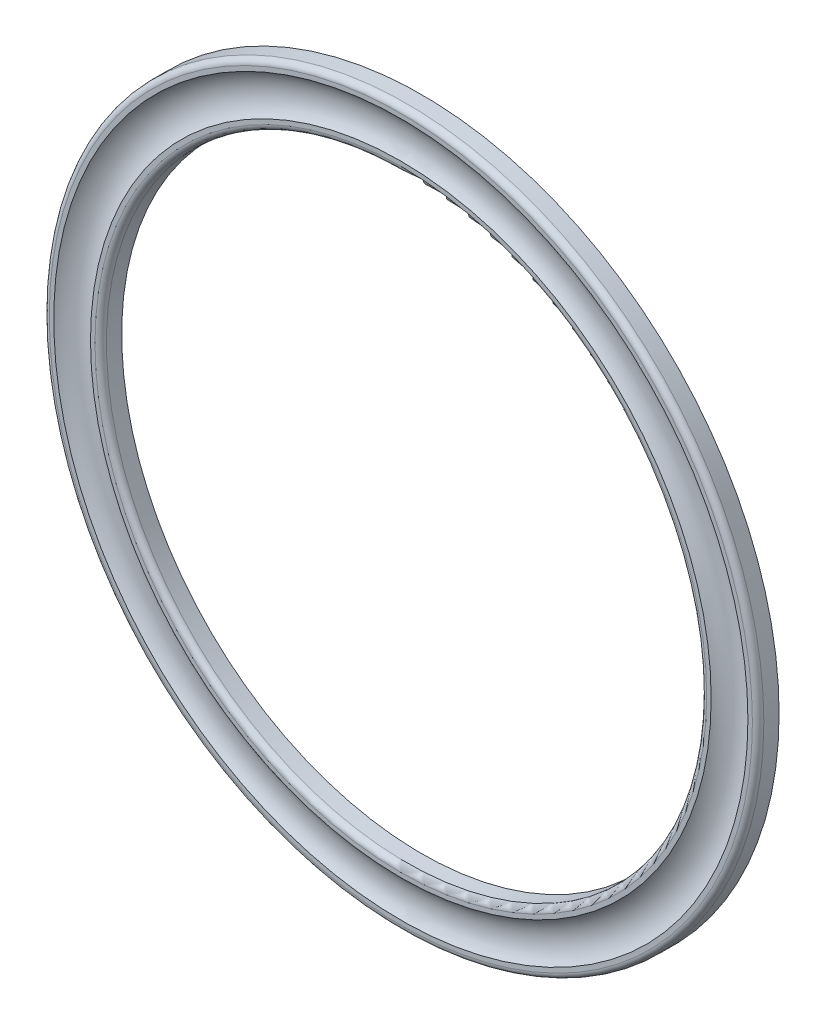
ISO-10303-21;
HEADER;
FILE_DESCRIPTION(('STEP AP214'),'2;1');
FILE_NAME('part.step','',(''),(''),'','','');
FILE_SCHEMA(('AUTOMOTIVE_DESIGN { 1 0 10303 214 1 1 1 1 }'));
ENDSEC;
DATA;
#1=APPLICATION_CONTEXT('core data for automotive mechanical design processes');
#2=APPLICATION_PROTOCOL_DEFINITION('international standard','automotive_design',2000,#1);
#3=PRODUCT_CONTEXT('',#1,'mechanical');
#4=PRODUCT('Part','Part','',(#3));
#5=PRODUCT_RELATED_PRODUCT_CATEGORY('part','',(#4));
#6=PRODUCT_DEFINITION_FORMATION('','',#4);
#7=PRODUCT_DEFINITION_CONTEXT('part definition',#1,'design');
#8=PRODUCT_DEFINITION('design','',#6,#7);
#9=PRODUCT_DEFINITION_SHAPE('','',#8);
#10=(LENGTH_UNIT() NAMED_UNIT(*) SI_UNIT(.MILLI.,.METRE.));
#11=(NAMED_UNIT(*) PLANE_ANGLE_UNIT() SI_UNIT($,.RADIAN.));
#12=(NAMED_UNIT(*) SI_UNIT($,.STERADIAN.) SOLID_ANGLE_UNIT());
#13=UNCERTAINTY_MEASURE_WITH_UNIT(LENGTH_MEASURE(1.E-05),#10,'distance_accuracy_value','');
#14=(GEOMETRIC_REPRESENTATION_CONTEXT(3) GLOBAL_UNCERTAINTY_ASSIGNED_CONTEXT((#13)) GLOBAL_UNIT_ASSIGNED_CONTEXT((#10,
#11,#12)) REPRESENTATION_CONTEXT('',''));
#15=CARTESIAN_POINT('',(0.,0.,0.));
#16=DIRECTION('',(0.,0.,1.));
#17=DIRECTION('',(1.,0.,0.));
#18=AXIS2_PLACEMENT_3D('',#15,#16,#17);
#19=CARTESIAN_POINT('',(115.,0.,0.));
#20=DIRECTION('',(0.,0.,1.));
#21=DIRECTION('',(1.,0.,0.));
#22=AXIS2_PLACEMENT_3D('',#19,#20,#21);
#23=TOROIDAL_SURFACE('',#22,115.,10.);
#24=CARTESIAN_POINT('',(115.,0.,-7.66044443118977));
#25=DIRECTION('',(0.,0.,1.));
#26=DIRECTION('',(1.,0.,0.));
#27=AXIS2_PLACEMENT_3D('',#24,#25,#26);
#28=CIRCLE('',#27,108.572123903135);
#29=CARTESIAN_POINT('',(223.572123903135,0.,-7.66044443118977));
#30=VERTEX_POINT('',#29);
#31=EDGE_CURVE('E10',#30,#30,#28,.T.);
#32=ORIENTED_EDGE('',*,*,#31,.F.);
#33=EDGE_LOOP('',(#32));
#34=FACE_BOUND('',#33,.T.);
#35=CARTESIAN_POINT('',(115.,0.,-7.66044443118977));
#36=DIRECTION('',(0.,0.,1.));
#37=DIRECTION('',(1.,0.,0.));
#38=AXIS2_PLACEMENT_3D('',#35,#36,#37);
#39=CIRCLE('',#38,121.427876096865);
#40=CARTESIAN_POINT('',(236.427876096865,0.,-7.66044443118977));
#41=VERTEX_POINT('',#40);
#42=EDGE_CURVE('E63',#41,#41,#39,.T.);
#43=ORIENTED_EDGE('',*,*,#42,.T.);
#44=EDGE_LOOP('',(#43));
#45=FACE_BOUND('',#44,.T.);
#46=ADVANCED_FACE('F35',(#34,#45),#23,.F.);
#47=CARTESIAN_POINT('',(7.99999999999998,0.,-7.66044443118977));
#48=DIRECTION('',(0.,0.,-1.));
#49=DIRECTION('',(-1.,0.,0.));
#50=AXIS2_PLACEMENT_3D('',#47,#48,#49);
#51=PLANE('',#50);
#52=CARTESIAN_POINT('',(115.,0.,-7.66044443118977));
#53=DIRECTION('',(0.,0.,1.));
#54=DIRECTION('',(1.,0.,0.));
#55=AXIS2_PLACEMENT_3D('',#52,#53,#54);
#56=CIRCLE('',#55,107.);
#57=CARTESIAN_POINT('',(222.,0.,-7.66044443118977));
#58=VERTEX_POINT('',#57);
#59=EDGE_CURVE('E41',#58,#58,#56,.T.);
#60=ORIENTED_EDGE('',*,*,#59,.F.);
#61=EDGE_LOOP('',(#60));
#62=FACE_BOUND('',#61,.T.);
#63=ORIENTED_EDGE('',*,*,#31,.T.);
#64=EDGE_LOOP('',(#63));
#65=FACE_BOUND('',#64,.T.);
#66=ADVANCED_FACE('F100',(#62,#65),#51,.F.);
#67=CARTESIAN_POINT('',(115.,0.,-9.66044443118977));
#68=DIRECTION('',(0.,0.,1.));
#69=DIRECTION('',(1.,0.,0.));
#70=AXIS2_PLACEMENT_3D('',#67,#68,#69);
#71=TOROIDAL_SURFACE('',#70,107.,2.);
#72=CARTESIAN_POINT('',(115.,0.,-9.66044443118978));
#73=DIRECTION('',(0.,0.,1.));
#74=DIRECTION('',(1.,0.,0.));
#75=AXIS2_PLACEMENT_3D('',#72,#73,#74);
#76=CIRCLE('',#75,105.);
#77=CARTESIAN_POINT('',(220.,0.,-9.66044443118978));
#78=VERTEX_POINT('',#77);
#79=EDGE_CURVE('E45',#78,#78,#76,.T.);
#80=ORIENTED_EDGE('',*,*,#79,.F.);
#81=EDGE_LOOP('',(#80));
#82=FACE_BOUND('',#81,.T.);
#83=ORIENTED_EDGE('',*,*,#59,.T.);
#84=EDGE_LOOP('',(#83));
#85=FACE_BOUND('',#84,.T.);
#86=ADVANCED_FACE('F95',(#82,#85),#71,.T.);
#87=CARTESIAN_POINT('',(115.,0.,57.0740158660835));
#88=DIRECTION('',(0.,0.,1.));
#89=DIRECTION('',(1.,0.,0.));
#90=AXIS2_PLACEMENT_3D('',#87,#88,#89);
#91=CYLINDRICAL_SURFACE('',#90,105.);
#92=CARTESIAN_POINT('',(115.,0.,-15.));
#93=DIRECTION('',(0.,0.,1.));
#94=DIRECTION('',(1.,0.,0.));
#95=AXIS2_PLACEMENT_3D('',#92,#93,#94);
#96=CIRCLE('',#95,105.);
#97=CARTESIAN_POINT('',(220.,0.,-15.));
#98=VERTEX_POINT('',#97);
#99=EDGE_CURVE('E49',#98,#98,#96,.T.);
#100=ORIENTED_EDGE('',*,*,#99,.F.);
#101=EDGE_LOOP('',(#100));
#102=FACE_BOUND('',#101,.T.);
#103=ORIENTED_EDGE('',*,*,#79,.T.);
#104=EDGE_LOOP('',(#103));
#105=FACE_BOUND('',#104,.T.);
#106=ADVANCED_FACE('F89',(#102,#105),#91,.F.);
#107=CARTESIAN_POINT('',(-10.,0.,-15.));
#108=DIRECTION('',(0.,0.,1.));
#109=DIRECTION('',(1.,0.,0.));
#110=AXIS2_PLACEMENT_3D('',#107,#108,#109);
#111=PLANE('',#110);
#112=CARTESIAN_POINT('',(115.,0.,-15.));
#113=DIRECTION('',(0.,0.,1.));
#114=DIRECTION('',(1.,0.,0.));
#115=AXIS2_PLACEMENT_3D('',#112,#113,#114);
#116=CIRCLE('',#115,125.);
#117=CARTESIAN_POINT('',(240.,0.,-15.));
#118=VERTEX_POINT('',#117);
#119=EDGE_CURVE('E54',#118,#118,#116,.T.);
#120=ORIENTED_EDGE('',*,*,#119,.F.);
#121=EDGE_LOOP('',(#120));
#122=FACE_BOUND('',#121,.T.);
#123=ORIENTED_EDGE('',*,*,#99,.T.);
#124=EDGE_LOOP('',(#123));
#125=FACE_BOUND('',#124,.T.);
#126=ADVANCED_FACE('F83',(#122,#125),#111,.F.);
#127=CARTESIAN_POINT('',(115.,0.,57.0740158660835));
#128=DIRECTION('',(0.,0.,1.));
#129=DIRECTION('',(1.,0.,0.));
#130=AXIS2_PLACEMENT_3D('',#127,#128,#129);
#131=CYLINDRICAL_SURFACE('',#130,125.);
#132=CARTESIAN_POINT('',(115.,0.,-9.66044443118978));
#133=DIRECTION('',(0.,0.,1.));
#134=DIRECTION('',(1.,0.,0.));
#135=AXIS2_PLACEMENT_3D('',#132,#133,#134);
#136=CIRCLE('',#135,125.);
#137=CARTESIAN_POINT('',(240.,0.,-9.66044443118978));
#138=VERTEX_POINT('',#137);
#139=EDGE_CURVE('E57',#138,#138,#136,.T.);
#140=ORIENTED_EDGE('',*,*,#139,.F.);
#141=EDGE_LOOP('',(#140));
#142=FACE_BOUND('',#141,.T.);
#143=ORIENTED_EDGE('',*,*,#119,.T.);
#144=EDGE_LOOP('',(#143));
#145=FACE_BOUND('',#144,.T.);
#146=ADVANCED_FACE('F77',(#142,#145),#131,.T.);
#147=CARTESIAN_POINT('',(115.,0.,-9.66044443118977));
#148=DIRECTION('',(0.,0.,1.));
#149=DIRECTION('',(1.,0.,0.));
#150=AXIS2_PLACEMENT_3D('',#147,#148,#149);
#151=TOROIDAL_SURFACE('',#150,123.,2.);
#152=CARTESIAN_POINT('',(115.,0.,-7.66044443118977));
#153=DIRECTION('',(0.,0.,1.));
#154=DIRECTION('',(1.,0.,0.));
#155=AXIS2_PLACEMENT_3D('',#152,#153,#154);
#156=CIRCLE('',#155,123.);
#157=CARTESIAN_POINT('',(238.,0.,-7.66044443118977));
#158=VERTEX_POINT('',#157);
#159=EDGE_CURVE('E60',#158,#158,#156,.T.);
#160=ORIENTED_EDGE('',*,*,#159,.F.);
#161=EDGE_LOOP('',(#160));
#162=FACE_BOUND('',#161,.T.);
#163=ORIENTED_EDGE('',*,*,#139,.T.);
#164=EDGE_LOOP('',(#163));
#165=FACE_BOUND('',#164,.T.);
#166=ADVANCED_FACE('F71',(#162,#165),#151,.T.);
#167=CARTESIAN_POINT('',(-7.99999999999998,0.,-7.66044443118977));
#168=DIRECTION('',(0.,0.,-1.));
#169=DIRECTION('',(-1.,0.,0.));
#170=AXIS2_PLACEMENT_3D('',#167,#168,#169);
#171=PLANE('',#170);
#172=ORIENTED_EDGE('',*,*,#42,.F.);
#173=EDGE_LOOP('',(#172));
#174=FACE_BOUND('',#173,.T.);
#175=ORIENTED_EDGE('',*,*,#159,.T.);
#176=EDGE_LOOP('',(#175));
#177=FACE_BOUND('',#176,.T.);
#178=ADVANCED_FACE('F68',(#174,#177),#171,.F.);
#179=CLOSED_SHELL('',(#46,#66,#86,#106,#126,#146,#166,#178));
#180=MANIFOLD_SOLID_BREP('B2',#179);
#181=ADVANCED_BREP_SHAPE_REPRESENTATION('',(#18,#180),#14);
#182=SHAPE_DEFINITION_REPRESENTATION(#9,#181);
ENDSEC;
END-ISO-10303-21;
